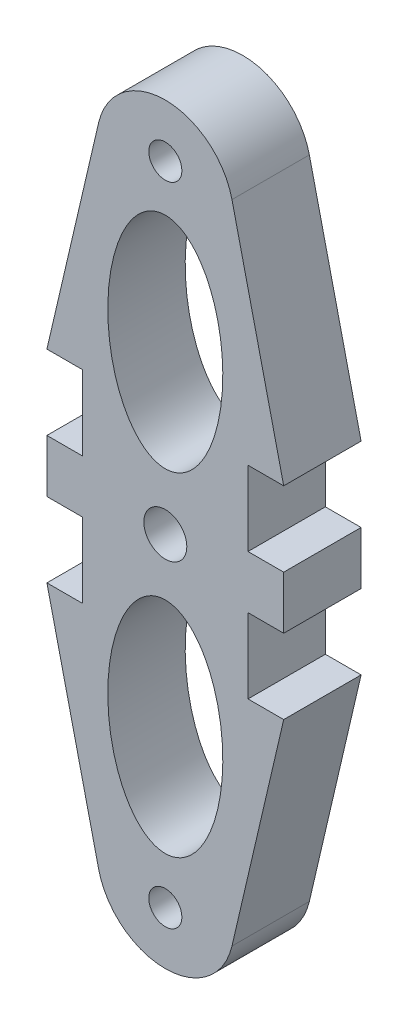
ISO-10303-21;
HEADER;
FILE_DESCRIPTION(('STEP AP214'),'2;1');
FILE_NAME('part.step','',(''),(''),'','','');
FILE_SCHEMA(('AUTOMOTIVE_DESIGN { 1 0 10303 214 1 1 1 1 }'));
ENDSEC;
DATA;
#1=APPLICATION_CONTEXT('core data for automotive mechanical design processes');
#2=APPLICATION_PROTOCOL_DEFINITION('international standard','automotive_design',2000,#1);
#3=PRODUCT_CONTEXT('',#1,'mechanical');
#4=PRODUCT('Part','Part','',(#3));
#5=PRODUCT_RELATED_PRODUCT_CATEGORY('part','',(#4));
#6=PRODUCT_DEFINITION_FORMATION('','',#4);
#7=PRODUCT_DEFINITION_CONTEXT('part definition',#1,'design');
#8=PRODUCT_DEFINITION('design','',#6,#7);
#9=PRODUCT_DEFINITION_SHAPE('','',#8);
#10=(LENGTH_UNIT() NAMED_UNIT(*) SI_UNIT(.MILLI.,.METRE.));
#11=(NAMED_UNIT(*) PLANE_ANGLE_UNIT() SI_UNIT($,.RADIAN.));
#12=(NAMED_UNIT(*) SI_UNIT($,.STERADIAN.) SOLID_ANGLE_UNIT());
#13=UNCERTAINTY_MEASURE_WITH_UNIT(LENGTH_MEASURE(1.E-05),#10,'distance_accuracy_value','');
#14=(GEOMETRIC_REPRESENTATION_CONTEXT(3) GLOBAL_UNCERTAINTY_ASSIGNED_CONTEXT((#13)) GLOBAL_UNIT_ASSIGNED_CONTEXT((#10,
#11,#12)) REPRESENTATION_CONTEXT('',''));
#15=CARTESIAN_POINT('',(0.,0.,0.));
#16=DIRECTION('',(0.,0.,1.));
#17=DIRECTION('',(1.,0.,0.));
#18=AXIS2_PLACEMENT_3D('',#15,#16,#17);
#19=CARTESIAN_POINT('',(839.333426128795,195.57212737232,5.85));
#20=DIRECTION('',(0.97391109101162,0.226929916063431,0.));
#21=DIRECTION('',(-0.226929916063431,0.97391109101162,0.));
#22=AXIS2_PLACEMENT_3D('',#19,#20,#21);
#23=PLANE('',#22);
#24=DIRECTION('',(0.226929916063431,-0.97391109101162,0.));
#25=VECTOR('',#24,1.);
#26=CARTESIAN_POINT('',(839.333426128795,195.57212737232,0.));
#27=LINE('',#26,#25);
#28=CARTESIAN_POINT('',(778.709168708765,455.752176393297,0.));
#29=VERTEX_POINT('',#28);
#30=CARTESIAN_POINT('',(782.620179880843,438.967359196733,0.));
#31=VERTEX_POINT('',#30);
#32=EDGE_CURVE('E316',#29,#31,#27,.T.);
#33=ORIENTED_EDGE('',*,*,#32,.T.);
#34=DIRECTION('',(0.,0.,-1.));
#35=VECTOR('',#34,1.);
#36=CARTESIAN_POINT('',(782.620179880843,438.967359196733,5.85));
#37=LINE('',#36,#35);
#38=CARTESIAN_POINT('',(782.620179880843,438.967359196733,5.85));
#39=VERTEX_POINT('',#38);
#40=EDGE_CURVE('E11',#39,#31,#37,.T.);
#41=ORIENTED_EDGE('',*,*,#40,.F.);
#42=DIRECTION('',(0.226929916063431,-0.97391109101162,0.));
#43=VECTOR('',#42,1.);
#44=CARTESIAN_POINT('',(839.333426128795,195.57212737232,5.85));
#45=LINE('',#44,#43);
#46=CARTESIAN_POINT('',(778.709168708765,455.752176393297,5.85));
#47=VERTEX_POINT('',#46);
#48=EDGE_CURVE('E471',#47,#39,#45,.T.);
#49=ORIENTED_EDGE('',*,*,#48,.F.);
#50=DIRECTION('',(0.,0.,-1.));
#51=VECTOR('',#50,1.);
#52=CARTESIAN_POINT('',(778.709168708765,455.752176393297,5.85));
#53=LINE('',#52,#51);
#54=EDGE_CURVE('E381',#47,#29,#53,.T.);
#55=ORIENTED_EDGE('',*,*,#54,.T.);
#56=EDGE_LOOP('',(#33,#41,#49,#55));
#57=FACE_BOUND('',#56,.T.);
#58=ADVANCED_FACE('F37',(#57),#23,.F.);
#59=CARTESIAN_POINT('',(787.659168708765,440.14148825463,5.85));
#60=DIRECTION('',(0.,0.,-1.));
#61=DIRECTION('',(-1.,0.,0.));
#62=AXIS2_PLACEMENT_3D('',#59,#60,#61);
#63=CYLINDRICAL_SURFACE('',#62,5.17397211555374);
#64=CARTESIAN_POINT('',(787.659168708765,440.14148825463,0.));
#65=DIRECTION('',(0.,0.,1.));
#66=DIRECTION('',(1.,0.,0.));
#67=AXIS2_PLACEMENT_3D('',#64,#65,#66);
#68=CIRCLE('',#67,5.17397211555374);
#69=CARTESIAN_POINT('',(792.698157536688,438.967359196733,0.));
#70=VERTEX_POINT('',#69);
#71=EDGE_CURVE('E320',#31,#70,#68,.T.);
#72=ORIENTED_EDGE('',*,*,#71,.T.);
#73=DIRECTION('',(0.,0.,-1.));
#74=VECTOR('',#73,1.);
#75=CARTESIAN_POINT('',(792.698157536688,438.967359196733,5.85));
#76=LINE('',#75,#74);
#77=CARTESIAN_POINT('',(792.698157536688,438.967359196733,5.85));
#78=VERTEX_POINT('',#77);
#79=EDGE_CURVE('E46',#78,#70,#76,.T.);
#80=ORIENTED_EDGE('',*,*,#79,.F.);
#81=CARTESIAN_POINT('',(787.659168708765,440.14148825463,5.85));
#82=DIRECTION('',(0.,0.,1.));
#83=DIRECTION('',(1.,0.,0.));
#84=AXIS2_PLACEMENT_3D('',#81,#82,#83);
#85=CIRCLE('',#84,5.17397211555374);
#86=EDGE_CURVE('E132',#39,#78,#85,.T.);
#87=ORIENTED_EDGE('',*,*,#86,.F.);
#88=ORIENTED_EDGE('',*,*,#40,.T.);
#89=EDGE_LOOP('',(#72,#80,#87,#88));
#90=FACE_BOUND('',#89,.T.);
#91=ADVANCED_FACE('F296',(#90),#63,.T.);
#92=CARTESIAN_POINT('',(654.860448590103,-152.588288605946,5.85));
#93=DIRECTION('',(-0.97391109101162,0.226929916063431,0.));
#94=DIRECTION('',(-0.226929916063431,-0.97391109101162,0.));
#95=AXIS2_PLACEMENT_3D('',#92,#93,#94);
#96=PLANE('',#95);
#97=DIRECTION('',(0.226929916063431,0.97391109101162,0.));
#98=VECTOR('',#97,1.);
#99=CARTESIAN_POINT('',(654.860448590103,-152.588288605946,0.));
#100=LINE('',#99,#98);
#101=CARTESIAN_POINT('',(796.609168708765,455.752176393297,0.));
#102=VERTEX_POINT('',#101);
#103=EDGE_CURVE('E325',#70,#102,#100,.T.);
#104=ORIENTED_EDGE('',*,*,#103,.T.);
#105=DIRECTION('',(0.,0.,-1.));
#106=VECTOR('',#105,1.);
#107=CARTESIAN_POINT('',(796.609168708765,455.752176393297,5.85));
#108=LINE('',#107,#106);
#109=CARTESIAN_POINT('',(796.609168708765,455.752176393297,5.85));
#110=VERTEX_POINT('',#109);
#111=EDGE_CURVE('E413',#110,#102,#108,.T.);
#112=ORIENTED_EDGE('',*,*,#111,.F.);
#113=DIRECTION('',(0.226929916063431,0.97391109101162,0.));
#114=VECTOR('',#113,1.);
#115=CARTESIAN_POINT('',(654.860448590103,-152.588288605946,5.85));
#116=LINE('',#115,#114);
#117=EDGE_CURVE('E418',#78,#110,#116,.T.);
#118=ORIENTED_EDGE('',*,*,#117,.F.);
#119=ORIENTED_EDGE('',*,*,#79,.T.);
#120=EDGE_LOOP('',(#104,#112,#118,#119));
#121=FACE_BOUND('',#120,.T.);
#122=ADVANCED_FACE('F292',(#121),#96,.F.);
#123=CARTESIAN_POINT('',(0.,455.752176393297,5.85));
#124=DIRECTION('',(0.,1.,0.));
#125=DIRECTION('',(0.,0.,1.));
#126=AXIS2_PLACEMENT_3D('',#123,#124,#125);
#127=PLANE('',#126);
#128=DIRECTION('',(1.,0.,0.));
#129=VECTOR('',#128,1.);
#130=CARTESIAN_POINT('',(0.,455.752176393297,0.));
#131=LINE('',#130,#129);
#132=CARTESIAN_POINT('',(793.909168708765,455.752176393297,0.));
#133=VERTEX_POINT('',#132);
#134=EDGE_CURVE('E328',#133,#102,#131,.T.);
#135=ORIENTED_EDGE('',*,*,#134,.F.);
#136=DIRECTION('',(0.,0.,-1.));
#137=VECTOR('',#136,1.);
#138=CARTESIAN_POINT('',(793.909168708765,455.752176393297,5.85));
#139=LINE('',#138,#137);
#140=CARTESIAN_POINT('',(793.909168708765,455.752176393297,5.85));
#141=VERTEX_POINT('',#140);
#142=EDGE_CURVE('E411',#141,#133,#139,.T.);
#143=ORIENTED_EDGE('',*,*,#142,.F.);
#144=DIRECTION('',(1.,0.,0.));
#145=VECTOR('',#144,1.);
#146=CARTESIAN_POINT('',(0.,455.752176393297,5.85));
#147=LINE('',#146,#145);
#148=EDGE_CURVE('E428',#141,#110,#147,.T.);
#149=ORIENTED_EDGE('',*,*,#148,.T.);
#150=ORIENTED_EDGE('',*,*,#111,.T.);
#151=EDGE_LOOP('',(#135,#143,#149,#150));
#152=FACE_BOUND('',#151,.T.);
#153=ADVANCED_FACE('F288',(#152),#127,.T.);
#154=CARTESIAN_POINT('',(793.909168708765,0.,5.85));
#155=DIRECTION('',(1.,0.,0.));
#156=DIRECTION('',(0.,0.,-1.));
#157=AXIS2_PLACEMENT_3D('',#154,#155,#156);
#158=PLANE('',#157);
#159=DIRECTION('',(0.,-1.,0.));
#160=VECTOR('',#159,1.);
#161=CARTESIAN_POINT('',(793.909168708765,0.,0.));
#162=LINE('',#161,#160);
#163=CARTESIAN_POINT('',(793.909168708765,461.402176393297,0.));
#164=VERTEX_POINT('',#163);
#165=EDGE_CURVE('E331',#164,#133,#162,.T.);
#166=ORIENTED_EDGE('',*,*,#165,.F.);
#167=DIRECTION('',(0.,0.,-1.));
#168=VECTOR('',#167,1.);
#169=CARTESIAN_POINT('',(793.909168708765,461.402176393297,5.85));
#170=LINE('',#169,#168);
#171=CARTESIAN_POINT('',(793.909168708765,461.402176393297,5.85));
#172=VERTEX_POINT('',#171);
#173=EDGE_CURVE('E409',#172,#164,#170,.T.);
#174=ORIENTED_EDGE('',*,*,#173,.F.);
#175=DIRECTION('',(0.,-1.,0.));
#176=VECTOR('',#175,1.);
#177=CARTESIAN_POINT('',(793.909168708765,0.,5.85));
#178=LINE('',#177,#176);
#179=EDGE_CURVE('E431',#172,#141,#178,.T.);
#180=ORIENTED_EDGE('',*,*,#179,.T.);
#181=ORIENTED_EDGE('',*,*,#142,.T.);
#182=EDGE_LOOP('',(#166,#174,#180,#181));
#183=FACE_BOUND('',#182,.T.);
#184=ADVANCED_FACE('F284',(#183),#158,.T.);
#185=CARTESIAN_POINT('',(0.,461.402176393297,5.85));
#186=DIRECTION('',(0.,1.,0.));
#187=DIRECTION('',(0.,0.,1.));
#188=AXIS2_PLACEMENT_3D('',#185,#186,#187);
#189=PLANE('',#188);
#190=DIRECTION('',(1.,0.,0.));
#191=VECTOR('',#190,1.);
#192=CARTESIAN_POINT('',(0.,461.402176393297,0.));
#193=LINE('',#192,#191);
#194=CARTESIAN_POINT('',(796.609168708765,461.402176393297,0.));
#195=VERTEX_POINT('',#194);
#196=EDGE_CURVE('E334',#164,#195,#193,.T.);
#197=ORIENTED_EDGE('',*,*,#196,.T.);
#198=DIRECTION('',(0.,0.,-1.));
#199=VECTOR('',#198,1.);
#200=CARTESIAN_POINT('',(796.609168708765,461.402176393297,5.85));
#201=LINE('',#200,#199);
#202=CARTESIAN_POINT('',(796.609168708765,461.402176393297,5.85));
#203=VERTEX_POINT('',#202);
#204=EDGE_CURVE('E407',#203,#195,#201,.T.);
#205=ORIENTED_EDGE('',*,*,#204,.F.);
#206=DIRECTION('',(1.,0.,0.));
#207=VECTOR('',#206,1.);
#208=CARTESIAN_POINT('',(0.,461.402176393297,5.85));
#209=LINE('',#208,#207);
#210=EDGE_CURVE('E433',#172,#203,#209,.T.);
#211=ORIENTED_EDGE('',*,*,#210,.F.);
#212=ORIENTED_EDGE('',*,*,#173,.T.);
#213=EDGE_LOOP('',(#197,#205,#211,#212));
#214=FACE_BOUND('',#213,.T.);
#215=ADVANCED_FACE('F280',(#214),#189,.F.);
#216=CARTESIAN_POINT('',(796.609168708765,0.,5.85));
#217=DIRECTION('',(1.,0.,0.));
#218=DIRECTION('',(0.,0.,-1.));
#219=AXIS2_PLACEMENT_3D('',#216,#217,#218);
#220=PLANE('',#219);
#221=DIRECTION('',(0.,-1.,0.));
#222=VECTOR('',#221,1.);
#223=CARTESIAN_POINT('',(796.609168708765,0.,0.));
#224=LINE('',#223,#222);
#225=CARTESIAN_POINT('',(796.609168708765,465.402542000168,0.));
#226=VERTEX_POINT('',#225);
#227=EDGE_CURVE('E337',#226,#195,#224,.T.);
#228=ORIENTED_EDGE('',*,*,#227,.F.);
#229=DIRECTION('',(0.,0.,-1.));
#230=VECTOR('',#229,1.);
#231=CARTESIAN_POINT('',(796.609168708765,465.402542000168,5.85));
#232=LINE('',#231,#230);
#233=CARTESIAN_POINT('',(796.609168708765,465.402542000168,5.85));
#234=VERTEX_POINT('',#233);
#235=EDGE_CURVE('E405',#234,#226,#232,.T.);
#236=ORIENTED_EDGE('',*,*,#235,.F.);
#237=DIRECTION('',(0.,-1.,0.));
#238=VECTOR('',#237,1.);
#239=CARTESIAN_POINT('',(796.609168708765,0.,5.85));
#240=LINE('',#239,#238);
#241=EDGE_CURVE('E439',#234,#203,#240,.T.);
#242=ORIENTED_EDGE('',*,*,#241,.T.);
#243=ORIENTED_EDGE('',*,*,#204,.T.);
#244=EDGE_LOOP('',(#228,#236,#242,#243));
#245=FACE_BOUND('',#244,.T.);
#246=ADVANCED_FACE('F276',(#245),#220,.T.);
#247=CARTESIAN_POINT('',(0.,465.402542000168,5.85));
#248=DIRECTION('',(0.,1.,0.));
#249=DIRECTION('',(0.,0.,1.));
#250=AXIS2_PLACEMENT_3D('',#247,#248,#249);
#251=PLANE('',#250);
#252=DIRECTION('',(1.,0.,0.));
#253=VECTOR('',#252,1.);
#254=CARTESIAN_POINT('',(0.,465.402542000168,0.));
#255=LINE('',#254,#253);
#256=CARTESIAN_POINT('',(793.909168708765,465.402542000168,0.));
#257=VERTEX_POINT('',#256);
#258=EDGE_CURVE('E340',#257,#226,#255,.T.);
#259=ORIENTED_EDGE('',*,*,#258,.F.);
#260=DIRECTION('',(0.,0.,-1.));
#261=VECTOR('',#260,1.);
#262=CARTESIAN_POINT('',(793.909168708765,465.402542000168,5.85));
#263=LINE('',#262,#261);
#264=CARTESIAN_POINT('',(793.909168708765,465.402542000168,5.85));
#265=VERTEX_POINT('',#264);
#266=EDGE_CURVE('E403',#265,#257,#263,.T.);
#267=ORIENTED_EDGE('',*,*,#266,.F.);
#268=DIRECTION('',(1.,0.,0.));
#269=VECTOR('',#268,1.);
#270=CARTESIAN_POINT('',(0.,465.402542000168,5.85));
#271=LINE('',#270,#269);
#272=EDGE_CURVE('E442',#265,#234,#271,.T.);
#273=ORIENTED_EDGE('',*,*,#272,.T.);
#274=ORIENTED_EDGE('',*,*,#235,.T.);
#275=EDGE_LOOP('',(#259,#267,#273,#274));
#276=FACE_BOUND('',#275,.T.);
#277=ADVANCED_FACE('F272',(#276),#251,.T.);
#278=CARTESIAN_POINT('',(793.909168708756,-1.56002874081677E-11,5.85));
#279=DIRECTION('',(-1.,0.,0.));
#280=DIRECTION('',(0.,-1.,0.));
#281=AXIS2_PLACEMENT_3D('',#278,#279,#280);
#282=PLANE('',#281);
#283=DIRECTION('',(0.,1.,0.));
#284=VECTOR('',#283,1.);
#285=CARTESIAN_POINT('',(793.909168708756,-1.56002874081677E-11,0.));
#286=LINE('',#285,#284);
#287=CARTESIAN_POINT('',(793.909168708765,471.052542000168,0.));
#288=VERTEX_POINT('',#287);
#289=EDGE_CURVE('E343',#257,#288,#286,.T.);
#290=ORIENTED_EDGE('',*,*,#289,.T.);
#291=DIRECTION('',(0.,0.,-1.));
#292=VECTOR('',#291,1.);
#293=CARTESIAN_POINT('',(793.909168708765,471.052542000168,5.85));
#294=LINE('',#293,#292);
#295=CARTESIAN_POINT('',(793.909168708765,471.052542000168,5.85));
#296=VERTEX_POINT('',#295);
#297=EDGE_CURVE('E400',#296,#288,#294,.T.);
#298=ORIENTED_EDGE('',*,*,#297,.F.);
#299=DIRECTION('',(0.,1.,0.));
#300=VECTOR('',#299,1.);
#301=CARTESIAN_POINT('',(793.909168708756,-1.56002874081677E-11,5.85));
#302=LINE('',#301,#300);
#303=EDGE_CURVE('E445',#265,#296,#302,.T.);
#304=ORIENTED_EDGE('',*,*,#303,.F.);
#305=ORIENTED_EDGE('',*,*,#266,.T.);
#306=EDGE_LOOP('',(#290,#298,#304,#305));
#307=FACE_BOUND('',#306,.T.);
#308=ADVANCED_FACE('F268',(#307),#282,.F.);
#309=CARTESIAN_POINT('',(0.,471.052542000168,5.85));
#310=DIRECTION('',(0.,1.,0.));
#311=DIRECTION('',(0.,0.,1.));
#312=AXIS2_PLACEMENT_3D('',#309,#310,#311);
#313=PLANE('',#312);
#314=DIRECTION('',(1.,0.,0.));
#315=VECTOR('',#314,1.);
#316=CARTESIAN_POINT('',(0.,471.052542000168,0.));
#317=LINE('',#316,#315);
#318=CARTESIAN_POINT('',(796.609168708765,471.052542000168,0.));
#319=VERTEX_POINT('',#318);
#320=EDGE_CURVE('E345',#288,#319,#317,.T.);
#321=ORIENTED_EDGE('',*,*,#320,.T.);
#322=DIRECTION('',(0.,0.,-1.));
#323=VECTOR('',#322,1.);
#324=CARTESIAN_POINT('',(796.609168708765,471.052542000168,5.85));
#325=LINE('',#324,#323);
#326=CARTESIAN_POINT('',(796.609168708765,471.052542000168,5.85));
#327=VERTEX_POINT('',#326);
#328=EDGE_CURVE('E398',#327,#319,#325,.T.);
#329=ORIENTED_EDGE('',*,*,#328,.F.);
#330=DIRECTION('',(1.,0.,0.));
#331=VECTOR('',#330,1.);
#332=CARTESIAN_POINT('',(0.,471.052542000168,5.85));
#333=LINE('',#332,#331);
#334=EDGE_CURVE('E447',#296,#327,#333,.T.);
#335=ORIENTED_EDGE('',*,*,#334,.F.);
#336=ORIENTED_EDGE('',*,*,#297,.T.);
#337=EDGE_LOOP('',(#321,#329,#335,#336));
#338=FACE_BOUND('',#337,.T.);
#339=ADVANCED_FACE('F264',(#338),#313,.F.);
#340=CARTESIAN_POINT('',(859.693153588296,200.316124320398,5.85));
#341=DIRECTION('',(0.97391109101162,0.226929916063431,0.));
#342=DIRECTION('',(-0.226929916063431,0.97391109101162,0.));
#343=AXIS2_PLACEMENT_3D('',#340,#341,#342);
#344=PLANE('',#343);
#345=DIRECTION('',(0.226929916063431,-0.97391109101162,0.));
#346=VECTOR('',#345,1.);
#347=CARTESIAN_POINT('',(859.693153588296,200.316124320398,0.));
#348=LINE('',#347,#346);
#349=CARTESIAN_POINT('',(792.698157536688,487.837359196733,0.));
#350=VERTEX_POINT('',#349);
#351=EDGE_CURVE('E348',#350,#319,#348,.T.);
#352=ORIENTED_EDGE('',*,*,#351,.F.);
#353=DIRECTION('',(0.,0.,-1.));
#354=VECTOR('',#353,1.);
#355=CARTESIAN_POINT('',(792.698157536688,487.837359196733,5.85));
#356=LINE('',#355,#354);
#357=CARTESIAN_POINT('',(792.698157536688,487.837359196733,5.85));
#358=VERTEX_POINT('',#357);
#359=EDGE_CURVE('E396',#358,#350,#356,.T.);
#360=ORIENTED_EDGE('',*,*,#359,.F.);
#361=DIRECTION('',(0.226929916063431,-0.97391109101162,0.));
#362=VECTOR('',#361,1.);
#363=CARTESIAN_POINT('',(859.693153588296,200.316124320398,5.85));
#364=LINE('',#363,#362);
#365=EDGE_CURVE('E449',#358,#327,#364,.T.);
#366=ORIENTED_EDGE('',*,*,#365,.T.);
#367=ORIENTED_EDGE('',*,*,#328,.T.);
#368=EDGE_LOOP('',(#352,#360,#366,#367));
#369=FACE_BOUND('',#368,.T.);
#370=ADVANCED_FACE('F260',(#369),#344,.T.);
#371=CARTESIAN_POINT('',(787.659168708765,486.663230138836,5.85));
#372=DIRECTION('',(0.,0.,-1.));
#373=DIRECTION('',(-1.,0.,0.));
#374=AXIS2_PLACEMENT_3D('',#371,#372,#373);
#375=CYLINDRICAL_SURFACE('',#374,5.17397211555373);
#376=CARTESIAN_POINT('',(787.659168708765,486.663230138836,0.));
#377=DIRECTION('',(0.,0.,1.));
#378=DIRECTION('',(1.,0.,0.));
#379=AXIS2_PLACEMENT_3D('',#376,#377,#378);
#380=CIRCLE('',#379,5.17397211555373);
#381=CARTESIAN_POINT('',(782.620179880843,487.837359196733,0.));
#382=VERTEX_POINT('',#381);
#383=EDGE_CURVE('E351',#382,#350,#380,.F.);
#384=ORIENTED_EDGE('',*,*,#383,.F.);
#385=DIRECTION('',(0.,0.,-1.));
#386=VECTOR('',#385,1.);
#387=CARTESIAN_POINT('',(782.620179880843,487.837359196733,5.85));
#388=LINE('',#387,#386);
#389=CARTESIAN_POINT('',(782.620179880843,487.837359196733,5.85));
#390=VERTEX_POINT('',#389);
#391=EDGE_CURVE('E394',#390,#382,#388,.T.);
#392=ORIENTED_EDGE('',*,*,#391,.F.);
#393=CARTESIAN_POINT('',(787.659168708765,486.663230138836,5.85));
#394=DIRECTION('',(0.,0.,1.));
#395=DIRECTION('',(1.,0.,0.));
#396=AXIS2_PLACEMENT_3D('',#393,#394,#395);
#397=CIRCLE('',#396,5.17397211555373);
#398=EDGE_CURVE('E452',#390,#358,#397,.F.);
#399=ORIENTED_EDGE('',*,*,#398,.T.);
#400=ORIENTED_EDGE('',*,*,#359,.T.);
#401=EDGE_LOOP('',(#384,#392,#399,#400));
#402=FACE_BOUND('',#401,.T.);
#403=ADVANCED_FACE('F256',(#402),#375,.T.);
#404=CARTESIAN_POINT('',(634.500721130602,-147.844291657868,5.85));
#405=DIRECTION('',(-0.97391109101162,0.226929916063431,0.));
#406=DIRECTION('',(-0.226929916063431,-0.97391109101162,0.));
#407=AXIS2_PLACEMENT_3D('',#404,#405,#406);
#408=PLANE('',#407);
#409=DIRECTION('',(0.226929916063431,0.97391109101162,0.));
#410=VECTOR('',#409,1.);
#411=CARTESIAN_POINT('',(634.500721130602,-147.844291657868,0.));
#412=LINE('',#411,#410);
#413=CARTESIAN_POINT('',(778.709168708765,471.052542000168,0.));
#414=VERTEX_POINT('',#413);
#415=EDGE_CURVE('E354',#414,#382,#412,.T.);
#416=ORIENTED_EDGE('',*,*,#415,.F.);
#417=DIRECTION('',(0.,0.,-1.));
#418=VECTOR('',#417,1.);
#419=CARTESIAN_POINT('',(778.709168708765,471.052542000168,5.85));
#420=LINE('',#419,#418);
#421=CARTESIAN_POINT('',(778.709168708765,471.052542000168,5.85));
#422=VERTEX_POINT('',#421);
#423=EDGE_CURVE('E392',#422,#414,#420,.T.);
#424=ORIENTED_EDGE('',*,*,#423,.F.);
#425=DIRECTION('',(0.226929916063431,0.97391109101162,0.));
#426=VECTOR('',#425,1.);
#427=CARTESIAN_POINT('',(634.500721130602,-147.844291657868,5.85));
#428=LINE('',#427,#426);
#429=EDGE_CURVE('E455',#422,#390,#428,.T.);
#430=ORIENTED_EDGE('',*,*,#429,.T.);
#431=ORIENTED_EDGE('',*,*,#391,.T.);
#432=EDGE_LOOP('',(#416,#424,#430,#431));
#433=FACE_BOUND('',#432,.T.);
#434=ADVANCED_FACE('F252',(#433),#408,.T.);
#435=CARTESIAN_POINT('',(0.,471.052542000168,5.85));
#436=DIRECTION('',(0.,-1.,0.));
#437=DIRECTION('',(0.,0.,-1.));
#438=AXIS2_PLACEMENT_3D('',#435,#436,#437);
#439=PLANE('',#438);
#440=DIRECTION('',(-1.,0.,0.));
#441=VECTOR('',#440,1.);
#442=CARTESIAN_POINT('',(0.,471.052542000168,0.));
#443=LINE('',#442,#441);
#444=CARTESIAN_POINT('',(781.409168708765,471.052542000168,0.));
#445=VERTEX_POINT('',#444);
#446=EDGE_CURVE('E357',#445,#414,#443,.T.);
#447=ORIENTED_EDGE('',*,*,#446,.F.);
#448=DIRECTION('',(0.,0.,-1.));
#449=VECTOR('',#448,1.);
#450=CARTESIAN_POINT('',(781.409168708765,471.052542000168,5.85));
#451=LINE('',#450,#449);
#452=CARTESIAN_POINT('',(781.409168708765,471.052542000168,5.85));
#453=VERTEX_POINT('',#452);
#454=EDGE_CURVE('E390',#453,#445,#451,.T.);
#455=ORIENTED_EDGE('',*,*,#454,.F.);
#456=DIRECTION('',(-1.,0.,0.));
#457=VECTOR('',#456,1.);
#458=CARTESIAN_POINT('',(0.,471.052542000168,5.85));
#459=LINE('',#458,#457);
#460=EDGE_CURVE('E458',#453,#422,#459,.T.);
#461=ORIENTED_EDGE('',*,*,#460,.T.);
#462=ORIENTED_EDGE('',*,*,#423,.T.);
#463=EDGE_LOOP('',(#447,#455,#461,#462));
#464=FACE_BOUND('',#463,.T.);
#465=ADVANCED_FACE('F248',(#464),#439,.T.);
#466=CARTESIAN_POINT('',(781.409168708765,0.,5.85));
#467=DIRECTION('',(-1.,0.,0.));
#468=DIRECTION('',(0.,0.,1.));
#469=AXIS2_PLACEMENT_3D('',#466,#467,#468);
#470=PLANE('',#469);
#471=DIRECTION('',(0.,1.,0.));
#472=VECTOR('',#471,1.);
#473=CARTESIAN_POINT('',(781.409168708765,0.,0.));
#474=LINE('',#473,#472);
#475=CARTESIAN_POINT('',(781.409168708765,465.402542000168,0.));
#476=VERTEX_POINT('',#475);
#477=EDGE_CURVE('E360',#476,#445,#474,.T.);
#478=ORIENTED_EDGE('',*,*,#477,.F.);
#479=DIRECTION('',(0.,0.,-1.));
#480=VECTOR('',#479,1.);
#481=CARTESIAN_POINT('',(781.409168708765,465.402542000168,5.85));
#482=LINE('',#481,#480);
#483=CARTESIAN_POINT('',(781.409168708765,465.402542000168,5.85));
#484=VERTEX_POINT('',#483);
#485=EDGE_CURVE('E388',#484,#476,#482,.T.);
#486=ORIENTED_EDGE('',*,*,#485,.F.);
#487=DIRECTION('',(0.,1.,0.));
#488=VECTOR('',#487,1.);
#489=CARTESIAN_POINT('',(781.409168708765,0.,5.85));
#490=LINE('',#489,#488);
#491=EDGE_CURVE('E461',#484,#453,#490,.T.);
#492=ORIENTED_EDGE('',*,*,#491,.T.);
#493=ORIENTED_EDGE('',*,*,#454,.T.);
#494=EDGE_LOOP('',(#478,#486,#492,#493));
#495=FACE_BOUND('',#494,.T.);
#496=ADVANCED_FACE('F244',(#495),#470,.T.);
#497=CARTESIAN_POINT('',(0.,465.402542000168,5.85));
#498=DIRECTION('',(0.,-1.,0.));
#499=DIRECTION('',(0.,0.,-1.));
#500=AXIS2_PLACEMENT_3D('',#497,#498,#499);
#501=PLANE('',#500);
#502=DIRECTION('',(-1.,0.,0.));
#503=VECTOR('',#502,1.);
#504=CARTESIAN_POINT('',(0.,465.402542000168,0.));
#505=LINE('',#504,#503);
#506=CARTESIAN_POINT('',(778.709168708765,465.402542000168,0.));
#507=VERTEX_POINT('',#506);
#508=EDGE_CURVE('E363',#476,#507,#505,.T.);
#509=ORIENTED_EDGE('',*,*,#508,.T.);
#510=DIRECTION('',(0.,0.,-1.));
#511=VECTOR('',#510,1.);
#512=CARTESIAN_POINT('',(778.709168708765,465.402542000168,5.85));
#513=LINE('',#512,#511);
#514=CARTESIAN_POINT('',(778.709168708765,465.402542000168,5.85));
#515=VERTEX_POINT('',#514);
#516=EDGE_CURVE('E385',#515,#507,#513,.T.);
#517=ORIENTED_EDGE('',*,*,#516,.F.);
#518=DIRECTION('',(-1.,0.,0.));
#519=VECTOR('',#518,1.);
#520=CARTESIAN_POINT('',(0.,465.402542000168,5.85));
#521=LINE('',#520,#519);
#522=EDGE_CURVE('E202',#484,#515,#521,.T.);
#523=ORIENTED_EDGE('',*,*,#522,.F.);
#524=ORIENTED_EDGE('',*,*,#485,.T.);
#525=EDGE_LOOP('',(#509,#517,#523,#524));
#526=FACE_BOUND('',#525,.T.);
#527=ADVANCED_FACE('F240',(#526),#501,.F.);
#528=CARTESIAN_POINT('',(778.709168708765,0.,5.85));
#529=DIRECTION('',(1.,0.,0.));
#530=DIRECTION('',(0.,0.,-1.));
#531=AXIS2_PLACEMENT_3D('',#528,#529,#530);
#532=PLANE('',#531);
#533=DIRECTION('',(0.,-1.,0.));
#534=VECTOR('',#533,1.);
#535=CARTESIAN_POINT('',(778.709168708765,0.,0.));
#536=LINE('',#535,#534);
#537=CARTESIAN_POINT('',(778.709168708765,461.402176393297,0.));
#538=VERTEX_POINT('',#537);
#539=EDGE_CURVE('E365',#507,#538,#536,.T.);
#540=ORIENTED_EDGE('',*,*,#539,.T.);
#541=DIRECTION('',(0.,0.,-1.));
#542=VECTOR('',#541,1.);
#543=CARTESIAN_POINT('',(778.709168708765,461.402176393297,5.85));
#544=LINE('',#543,#542);
#545=CARTESIAN_POINT('',(778.709168708765,461.402176393297,5.85));
#546=VERTEX_POINT('',#545);
#547=EDGE_CURVE('E190',#546,#538,#544,.T.);
#548=ORIENTED_EDGE('',*,*,#547,.F.);
#549=DIRECTION('',(0.,-1.,0.));
#550=VECTOR('',#549,1.);
#551=CARTESIAN_POINT('',(778.709168708765,0.,5.85));
#552=LINE('',#551,#550);
#553=EDGE_CURVE('E199',#515,#546,#552,.T.);
#554=ORIENTED_EDGE('',*,*,#553,.F.);
#555=ORIENTED_EDGE('',*,*,#516,.T.);
#556=EDGE_LOOP('',(#540,#548,#554,#555));
#557=FACE_BOUND('',#556,.T.);
#558=ADVANCED_FACE('F237',(#557),#532,.F.);
#559=CARTESIAN_POINT('',(0.,461.402176393297,5.85));
#560=DIRECTION('',(0.,-1.,0.));
#561=DIRECTION('',(0.,0.,-1.));
#562=AXIS2_PLACEMENT_3D('',#559,#560,#561);
#563=PLANE('',#562);
#564=DIRECTION('',(-1.,0.,0.));
#565=VECTOR('',#564,1.);
#566=CARTESIAN_POINT('',(0.,461.402176393297,0.));
#567=LINE('',#566,#565);
#568=CARTESIAN_POINT('',(781.409168708765,461.402176393297,0.));
#569=VERTEX_POINT('',#568);
#570=EDGE_CURVE('E189',#569,#538,#567,.T.);
#571=ORIENTED_EDGE('',*,*,#570,.F.);
#572=DIRECTION('',(0.,0.,-1.));
#573=VECTOR('',#572,1.);
#574=CARTESIAN_POINT('',(781.409168708765,461.402176393297,5.85));
#575=LINE('',#574,#573);
#576=CARTESIAN_POINT('',(781.409168708765,461.402176393297,5.85));
#577=VERTEX_POINT('',#576);
#578=EDGE_CURVE('E183',#577,#569,#575,.T.);
#579=ORIENTED_EDGE('',*,*,#578,.F.);
#580=DIRECTION('',(-1.,0.,0.));
#581=VECTOR('',#580,1.);
#582=CARTESIAN_POINT('',(0.,461.402176393297,5.85));
#583=LINE('',#582,#581);
#584=EDGE_CURVE('E187',#577,#546,#583,.T.);
#585=ORIENTED_EDGE('',*,*,#584,.T.);
#586=ORIENTED_EDGE('',*,*,#547,.T.);
#587=EDGE_LOOP('',(#571,#579,#585,#586));
#588=FACE_BOUND('',#587,.T.);
#589=ADVANCED_FACE('F185',(#588),#563,.T.);
#590=CARTESIAN_POINT('',(781.409168708765,0.,5.85));
#591=DIRECTION('',(1.,0.,0.));
#592=DIRECTION('',(0.,0.,-1.));
#593=AXIS2_PLACEMENT_3D('',#590,#591,#592);
#594=PLANE('',#593);
#595=DIRECTION('',(0.,-1.,0.));
#596=VECTOR('',#595,1.);
#597=CARTESIAN_POINT('',(781.409168708765,0.,0.));
#598=LINE('',#597,#596);
#599=CARTESIAN_POINT('',(781.409168708765,455.752176393297,0.));
#600=VERTEX_POINT('',#599);
#601=EDGE_CURVE('E118',#569,#600,#598,.T.);
#602=ORIENTED_EDGE('',*,*,#601,.T.);
#603=DIRECTION('',(0.,0.,-1.));
#604=VECTOR('',#603,1.);
#605=CARTESIAN_POINT('',(781.409168708765,455.752176393297,5.85));
#606=LINE('',#605,#604);
#607=CARTESIAN_POINT('',(781.409168708765,455.752176393297,5.85));
#608=VERTEX_POINT('',#607);
#609=EDGE_CURVE('E191',#608,#600,#606,.T.);
#610=ORIENTED_EDGE('',*,*,#609,.F.);
#611=DIRECTION('',(0.,-1.,0.));
#612=VECTOR('',#611,1.);
#613=CARTESIAN_POINT('',(781.409168708765,0.,5.85));
#614=LINE('',#613,#612);
#615=EDGE_CURVE('E193',#577,#608,#614,.T.);
#616=ORIENTED_EDGE('',*,*,#615,.F.);
#617=ORIENTED_EDGE('',*,*,#578,.T.);
#618=EDGE_LOOP('',(#602,#610,#616,#617));
#619=FACE_BOUND('',#618,.T.);
#620=ADVANCED_FACE('F194',(#619),#594,.F.);
#621=CARTESIAN_POINT('',(787.659168708765,475.998301041015,5.85));
#622=DIRECTION('',(0.,0.,1.));
#623=DIRECTION('',(0.,1.,0.));
#624=AXIS2_PLACEMENT_3D('',#621,#622,#623);
#625=ELLIPSE('',#624,8.30208055455722,4.34649741649051);
#626=DIRECTION('',(0.,0.,-1.));
#627=VECTOR('',#626,1.);
#628=SURFACE_OF_LINEAR_EXTRUSION('',#625,#627);
#629=CARTESIAN_POINT('',(787.659168708765,484.300381595573,5.85));
#630=VERTEX_POINT('',#629);
#631=EDGE_CURVE('E210',#630,#630,#625,.T.);
#632=ORIENTED_EDGE('',*,*,#631,.T.);
#633=EDGE_LOOP('',(#632));
#634=FACE_BOUND('',#633,.T.);
#635=CARTESIAN_POINT('',(787.659168708765,475.998301041015,0.));
#636=DIRECTION('',(0.,0.,1.));
#637=DIRECTION('',(0.,1.,0.));
#638=AXIS2_PLACEMENT_3D('',#635,#636,#637);
#639=ELLIPSE('',#638,8.30208055455722,4.34649741649051);
#640=CARTESIAN_POINT('',(787.659168708765,484.300381595573,0.));
#641=VERTEX_POINT('',#640);
#642=EDGE_CURVE('E374',#641,#641,#639,.T.);
#643=ORIENTED_EDGE('',*,*,#642,.F.);
#644=EDGE_LOOP('',(#643));
#645=FACE_BOUND('',#644,.T.);
#646=ADVANCED_FACE('F218',(#634,#645),#628,.T.);
#647=CARTESIAN_POINT('',(787.659168708765,463.402359196733,5.85));
#648=DIRECTION('',(0.,0.,-1.));
#649=DIRECTION('',(-1.,0.,0.));
#650=AXIS2_PLACEMENT_3D('',#647,#648,#649);
#651=CYLINDRICAL_SURFACE('',#650,1.62499999999997);
#652=CARTESIAN_POINT('',(787.659168708765,463.402359196733,5.85));
#653=DIRECTION('',(0.,0.,1.));
#654=DIRECTION('',(1.,0.,0.));
#655=AXIS2_PLACEMENT_3D('',#652,#653,#654);
#656=CIRCLE('',#655,1.62499999999997);
#657=CARTESIAN_POINT('',(789.284168708765,463.402359196733,5.85));
#658=VERTEX_POINT('',#657);
#659=EDGE_CURVE('E207',#658,#658,#656,.T.);
#660=ORIENTED_EDGE('',*,*,#659,.T.);
#661=EDGE_LOOP('',(#660));
#662=FACE_BOUND('',#661,.T.);
#663=CARTESIAN_POINT('',(787.659168708765,463.402359196733,0.));
#664=DIRECTION('',(0.,0.,1.));
#665=DIRECTION('',(1.,0.,0.));
#666=AXIS2_PLACEMENT_3D('',#663,#664,#665);
#667=CIRCLE('',#666,1.62499999999997);
#668=CARTESIAN_POINT('',(789.284168708765,463.402359196733,0.));
#669=VERTEX_POINT('',#668);
#670=EDGE_CURVE('E371',#669,#669,#667,.T.);
#671=ORIENTED_EDGE('',*,*,#670,.F.);
#672=EDGE_LOOP('',(#671));
#673=FACE_BOUND('',#672,.T.);
#674=ADVANCED_FACE('F222',(#662,#673),#651,.F.);
#675=CARTESIAN_POINT('',(0.,455.752176393297,5.85));
#676=DIRECTION('',(0.,-1.,0.));
#677=DIRECTION('',(0.,0.,-1.));
#678=AXIS2_PLACEMENT_3D('',#675,#676,#677);
#679=PLANE('',#678);
#680=DIRECTION('',(-1.,0.,0.));
#681=VECTOR('',#680,1.);
#682=CARTESIAN_POINT('',(0.,455.752176393297,0.));
#683=LINE('',#682,#681);
#684=EDGE_CURVE('E124',#600,#29,#683,.T.);
#685=ORIENTED_EDGE('',*,*,#684,.T.);
#686=ORIENTED_EDGE('',*,*,#54,.F.);
#687=DIRECTION('',(-1.,0.,0.));
#688=VECTOR('',#687,1.);
#689=CARTESIAN_POINT('',(0.,455.752176393297,5.85));
#690=LINE('',#689,#688);
#691=EDGE_CURVE('E54',#608,#47,#690,.T.);
#692=ORIENTED_EDGE('',*,*,#691,.F.);
#693=ORIENTED_EDGE('',*,*,#609,.T.);
#694=EDGE_LOOP('',(#685,#686,#692,#693));
#695=FACE_BOUND('',#694,.T.);
#696=ADVANCED_FACE('F228',(#695),#679,.F.);
#697=CARTESIAN_POINT('',(787.659168708765,487.837359196733,5.85));
#698=DIRECTION('',(0.,0.,-1.));
#699=DIRECTION('',(-1.,0.,0.));
#700=AXIS2_PLACEMENT_3D('',#697,#698,#699);
#701=CYLINDRICAL_SURFACE('',#700,1.24999999999996);
#702=CARTESIAN_POINT('',(787.659168708765,487.837359196733,5.85));
#703=DIRECTION('',(0.,0.,1.));
#704=DIRECTION('',(1.,0.,0.));
#705=AXIS2_PLACEMENT_3D('',#702,#703,#704);
#706=CIRCLE('',#705,1.24999999999996);
#707=CARTESIAN_POINT('',(788.909168708765,487.837359196733,5.85));
#708=VERTEX_POINT('',#707);
#709=EDGE_CURVE('E311',#708,#708,#706,.T.);
#710=ORIENTED_EDGE('',*,*,#709,.T.);
#711=EDGE_LOOP('',(#710));
#712=FACE_BOUND('',#711,.T.);
#713=CARTESIAN_POINT('',(787.659168708765,487.837359196733,0.));
#714=DIRECTION('',(0.,0.,1.));
#715=DIRECTION('',(1.,0.,0.));
#716=AXIS2_PLACEMENT_3D('',#713,#714,#715);
#717=CIRCLE('',#716,1.24999999999996);
#718=CARTESIAN_POINT('',(788.909168708765,487.837359196733,0.));
#719=VERTEX_POINT('',#718);
#720=EDGE_CURVE('E314',#719,#719,#717,.T.);
#721=ORIENTED_EDGE('',*,*,#720,.F.);
#722=EDGE_LOOP('',(#721));
#723=FACE_BOUND('',#722,.T.);
#724=ADVANCED_FACE('F232',(#712,#723),#701,.F.);
#725=CARTESIAN_POINT('',(787.659168708765,438.967359196733,5.85));
#726=DIRECTION('',(0.,0.,-1.));
#727=DIRECTION('',(-1.,0.,0.));
#728=AXIS2_PLACEMENT_3D('',#725,#726,#727);
#729=CYLINDRICAL_SURFACE('',#728,1.24999999999996);
#730=CARTESIAN_POINT('',(787.659168708765,438.967359196733,5.85));
#731=DIRECTION('',(0.,0.,1.));
#732=DIRECTION('',(1.,0.,0.));
#733=AXIS2_PLACEMENT_3D('',#730,#731,#732);
#734=CIRCLE('',#733,1.24999999999996);
#735=CARTESIAN_POINT('',(788.909168708765,438.967359196733,5.85));
#736=VERTEX_POINT('',#735);
#737=EDGE_CURVE('E380',#736,#736,#734,.F.);
#738=ORIENTED_EDGE('',*,*,#737,.F.);
#739=EDGE_LOOP('',(#738));
#740=FACE_BOUND('',#739,.T.);
#741=CARTESIAN_POINT('',(787.659168708765,438.967359196733,0.));
#742=DIRECTION('',(0.,0.,1.));
#743=DIRECTION('',(1.,0.,0.));
#744=AXIS2_PLACEMENT_3D('',#741,#742,#743);
#745=CIRCLE('',#744,1.24999999999996);
#746=CARTESIAN_POINT('',(788.909168708765,438.967359196733,0.));
#747=VERTEX_POINT('',#746);
#748=EDGE_CURVE('E317',#747,#747,#745,.F.);
#749=ORIENTED_EDGE('',*,*,#748,.T.);
#750=EDGE_LOOP('',(#749));
#751=FACE_BOUND('',#750,.T.);
#752=ADVANCED_FACE('F39',(#740,#751),#729,.F.);
#753=CARTESIAN_POINT('',(787.659168708765,450.80641735245,5.85));
#754=DIRECTION('',(0.,0.,-1.));
#755=DIRECTION('',(0.,-1.,0.));
#756=AXIS2_PLACEMENT_3D('',#753,#754,#755);
#757=ELLIPSE('',#756,8.30208055455728,4.34649741649051);
#758=DIRECTION('',(0.,0.,-1.));
#759=VECTOR('',#758,1.);
#760=SURFACE_OF_LINEAR_EXTRUSION('',#757,#759);
#761=CARTESIAN_POINT('',(787.659168708765,442.504336797893,5.85));
#762=VERTEX_POINT('',#761);
#763=EDGE_CURVE('E214',#762,#762,#757,.T.);
#764=ORIENTED_EDGE('',*,*,#763,.F.);
#765=EDGE_LOOP('',(#764));
#766=FACE_BOUND('',#765,.T.);
#767=CARTESIAN_POINT('',(787.659168708765,450.80641735245,0.));
#768=DIRECTION('',(0.,0.,-1.));
#769=DIRECTION('',(0.,-1.,0.));
#770=AXIS2_PLACEMENT_3D('',#767,#768,#769);
#771=ELLIPSE('',#770,8.30208055455728,4.34649741649051);
#772=CARTESIAN_POINT('',(787.659168708765,442.504336797893,0.));
#773=VERTEX_POINT('',#772);
#774=EDGE_CURVE('E377',#773,#773,#771,.T.);
#775=ORIENTED_EDGE('',*,*,#774,.T.);
#776=EDGE_LOOP('',(#775));
#777=FACE_BOUND('',#776,.T.);
#778=ADVANCED_FACE('F224',(#766,#777),#760,.F.);
#779=CARTESIAN_POINT('',(0.,0.,5.85));
#780=DIRECTION('',(0.,0.,1.));
#781=DIRECTION('',(1.,0.,0.));
#782=AXIS2_PLACEMENT_3D('',#779,#780,#781);
#783=PLANE('',#782);
#784=ORIENTED_EDGE('',*,*,#737,.T.);
#785=EDGE_LOOP('',(#784));
#786=FACE_BOUND('',#785,.T.);
#787=ORIENTED_EDGE('',*,*,#709,.F.);
#788=EDGE_LOOP('',(#787));
#789=FACE_BOUND('',#788,.T.);
#790=ORIENTED_EDGE('',*,*,#48,.T.);
#791=ORIENTED_EDGE('',*,*,#86,.T.);
#792=ORIENTED_EDGE('',*,*,#117,.T.);
#793=ORIENTED_EDGE('',*,*,#148,.F.);
#794=ORIENTED_EDGE('',*,*,#179,.F.);
#795=ORIENTED_EDGE('',*,*,#210,.T.);
#796=ORIENTED_EDGE('',*,*,#241,.F.);
#797=ORIENTED_EDGE('',*,*,#272,.F.);
#798=ORIENTED_EDGE('',*,*,#303,.T.);
#799=ORIENTED_EDGE('',*,*,#334,.T.);
#800=ORIENTED_EDGE('',*,*,#365,.F.);
#801=ORIENTED_EDGE('',*,*,#398,.F.);
#802=ORIENTED_EDGE('',*,*,#429,.F.);
#803=ORIENTED_EDGE('',*,*,#460,.F.);
#804=ORIENTED_EDGE('',*,*,#491,.F.);
#805=ORIENTED_EDGE('',*,*,#522,.T.);
#806=ORIENTED_EDGE('',*,*,#553,.T.);
#807=ORIENTED_EDGE('',*,*,#584,.F.);
#808=ORIENTED_EDGE('',*,*,#615,.T.);
#809=ORIENTED_EDGE('',*,*,#691,.T.);
#810=EDGE_LOOP('',(#790,#791,#792,#793,#794,#795,#796,#797,#798,#799,#800,#801,#802,#803,#804,
#805,#806,#807,#808,#809));
#811=FACE_BOUND('',#810,.T.);
#812=ORIENTED_EDGE('',*,*,#659,.F.);
#813=EDGE_LOOP('',(#812));
#814=FACE_BOUND('',#813,.T.);
#815=ORIENTED_EDGE('',*,*,#631,.F.);
#816=EDGE_LOOP('',(#815));
#817=FACE_BOUND('',#816,.T.);
#818=ORIENTED_EDGE('',*,*,#763,.T.);
#819=EDGE_LOOP('',(#818));
#820=FACE_BOUND('',#819,.T.);
#821=ADVANCED_FACE('F196',(#786,#789,#811,#814,#817,#820),#783,.T.);
#822=CARTESIAN_POINT('',(0.,0.,0.));
#823=DIRECTION('',(0.,0.,1.));
#824=DIRECTION('',(1.,0.,0.));
#825=AXIS2_PLACEMENT_3D('',#822,#823,#824);
#826=PLANE('',#825);
#827=ORIENTED_EDGE('',*,*,#748,.F.);
#828=EDGE_LOOP('',(#827));
#829=FACE_BOUND('',#828,.T.);
#830=ORIENTED_EDGE('',*,*,#720,.T.);
#831=EDGE_LOOP('',(#830));
#832=FACE_BOUND('',#831,.T.);
#833=ORIENTED_EDGE('',*,*,#32,.F.);
#834=ORIENTED_EDGE('',*,*,#684,.F.);
#835=ORIENTED_EDGE('',*,*,#601,.F.);
#836=ORIENTED_EDGE('',*,*,#570,.T.);
#837=ORIENTED_EDGE('',*,*,#539,.F.);
#838=ORIENTED_EDGE('',*,*,#508,.F.);
#839=ORIENTED_EDGE('',*,*,#477,.T.);
#840=ORIENTED_EDGE('',*,*,#446,.T.);
#841=ORIENTED_EDGE('',*,*,#415,.T.);
#842=ORIENTED_EDGE('',*,*,#383,.T.);
#843=ORIENTED_EDGE('',*,*,#351,.T.);
#844=ORIENTED_EDGE('',*,*,#320,.F.);
#845=ORIENTED_EDGE('',*,*,#289,.F.);
#846=ORIENTED_EDGE('',*,*,#258,.T.);
#847=ORIENTED_EDGE('',*,*,#227,.T.);
#848=ORIENTED_EDGE('',*,*,#196,.F.);
#849=ORIENTED_EDGE('',*,*,#165,.T.);
#850=ORIENTED_EDGE('',*,*,#134,.T.);
#851=ORIENTED_EDGE('',*,*,#103,.F.);
#852=ORIENTED_EDGE('',*,*,#71,.F.);
#853=EDGE_LOOP('',(#833,#834,#835,#836,#837,#838,#839,#840,#841,#842,#843,#844,#845,#846,#847,
#848,#849,#850,#851,#852));
#854=FACE_BOUND('',#853,.T.);
#855=ORIENTED_EDGE('',*,*,#670,.T.);
#856=EDGE_LOOP('',(#855));
#857=FACE_BOUND('',#856,.T.);
#858=ORIENTED_EDGE('',*,*,#642,.T.);
#859=EDGE_LOOP('',(#858));
#860=FACE_BOUND('',#859,.T.);
#861=ORIENTED_EDGE('',*,*,#774,.F.);
#862=EDGE_LOOP('',(#861));
#863=FACE_BOUND('',#862,.T.);
#864=ADVANCED_FACE('F421',(#829,#832,#854,#857,#860,#863),#826,.F.);
#865=CLOSED_SHELL('',(#58,#91,#122,#153,#184,#215,#246,#277,#308,#339,#370,#403,#434,#465,#496,
#527,#558,#589,#620,#646,#674,#696,#724,#752,#778,#821,#864));
#866=MANIFOLD_SOLID_BREP('B2',#865);
#867=ADVANCED_BREP_SHAPE_REPRESENTATION('',(#18,#866),#14);
#868=SHAPE_DEFINITION_REPRESENTATION(#9,#867);
ENDSEC;
END-ISO-10303-21;
